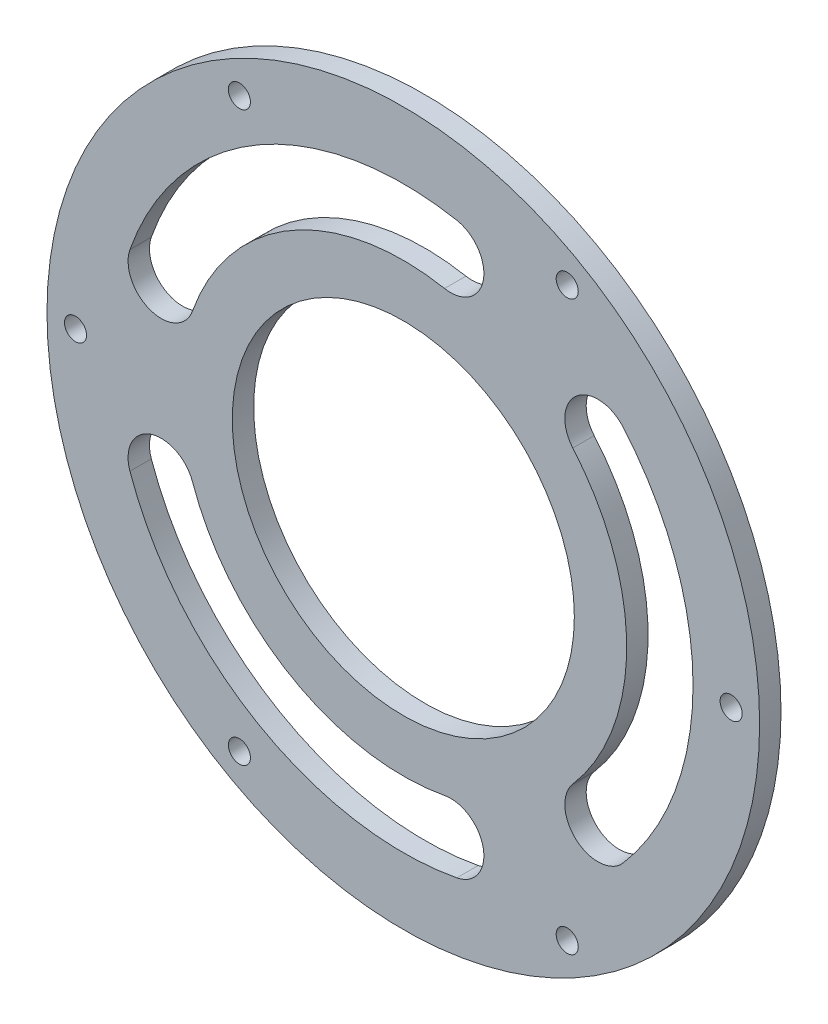
ISO-10303-21;
HEADER;
FILE_DESCRIPTION(('STEP AP214'),'2;1');
FILE_NAME('part.step','',(''),(''),'','','');
FILE_SCHEMA(('AUTOMOTIVE_DESIGN { 1 0 10303 214 1 1 1 1 }'));
ENDSEC;
DATA;
#1=APPLICATION_CONTEXT('core data for automotive mechanical design processes');
#2=APPLICATION_PROTOCOL_DEFINITION('international standard','automotive_design',2000,#1);
#3=PRODUCT_CONTEXT('',#1,'mechanical');
#4=PRODUCT('Part','Part','',(#3));
#5=PRODUCT_RELATED_PRODUCT_CATEGORY('part','',(#4));
#6=PRODUCT_DEFINITION_FORMATION('','',#4);
#7=PRODUCT_DEFINITION_CONTEXT('part definition',#1,'design');
#8=PRODUCT_DEFINITION('design','',#6,#7);
#9=PRODUCT_DEFINITION_SHAPE('','',#8);
#10=(LENGTH_UNIT() NAMED_UNIT(*) SI_UNIT(.MILLI.,.METRE.));
#11=(NAMED_UNIT(*) PLANE_ANGLE_UNIT() SI_UNIT($,.RADIAN.));
#12=(NAMED_UNIT(*) SI_UNIT($,.STERADIAN.) SOLID_ANGLE_UNIT());
#13=UNCERTAINTY_MEASURE_WITH_UNIT(LENGTH_MEASURE(1.E-05),#10,'distance_accuracy_value','');
#14=(GEOMETRIC_REPRESENTATION_CONTEXT(3) GLOBAL_UNCERTAINTY_ASSIGNED_CONTEXT((#13)) GLOBAL_UNIT_ASSIGNED_CONTEXT((#10,
#11,#12)) REPRESENTATION_CONTEXT('',''));
#15=CARTESIAN_POINT('',(0.,0.,0.));
#16=DIRECTION('',(0.,0.,1.));
#17=DIRECTION('',(1.,0.,0.));
#18=AXIS2_PLACEMENT_3D('',#15,#16,#17);
#19=CARTESIAN_POINT('',(0.,0.,3.));
#20=DIRECTION('',(0.,0.,1.));
#21=DIRECTION('',(1.,0.,0.));
#22=AXIS2_PLACEMENT_3D('',#19,#20,#21);
#23=PLANE('',#22);
#24=CARTESIAN_POINT('',(0.,0.,3.));
#25=DIRECTION('',(0.,0.,1.));
#26=DIRECTION('',(1.,0.,0.));
#27=AXIS2_PLACEMENT_3D('',#24,#25,#26);
#28=CIRCLE('',#27,24.);
#29=CARTESIAN_POINT('',(24.,0.,3.));
#30=VERTEX_POINT('',#29);
#31=EDGE_CURVE('E223',#30,#30,#28,.T.);
#32=ORIENTED_EDGE('',*,*,#31,.F.);
#33=EDGE_LOOP('',(#32));
#34=FACE_BOUND('',#33,.T.);
#35=CARTESIAN_POINT('',(-23.,39.8371685740842,3.));
#36=DIRECTION('',(0.,0.,1.));
#37=DIRECTION('',(1.,0.,0.));
#38=AXIS2_PLACEMENT_3D('',#35,#36,#37);
#39=CIRCLE('',#38,1.55);
#40=CARTESIAN_POINT('',(-21.45,39.8371685740842,3.));
#41=VERTEX_POINT('',#40);
#42=EDGE_CURVE('E240',#41,#41,#39,.T.);
#43=ORIENTED_EDGE('',*,*,#42,.F.);
#44=EDGE_LOOP('',(#43));
#45=FACE_BOUND('',#44,.T.);
#46=CARTESIAN_POINT('',(-23.,-39.8371685740842,3.));
#47=DIRECTION('',(0.,0.,1.));
#48=DIRECTION('',(1.,0.,0.));
#49=AXIS2_PLACEMENT_3D('',#46,#47,#48);
#50=CIRCLE('',#49,1.55);
#51=CARTESIAN_POINT('',(-21.45,-39.8371685740842,3.));
#52=VERTEX_POINT('',#51);
#53=EDGE_CURVE('E248',#52,#52,#50,.T.);
#54=ORIENTED_EDGE('',*,*,#53,.F.);
#55=EDGE_LOOP('',(#54));
#56=FACE_BOUND('',#55,.T.);
#57=CARTESIAN_POINT('',(46.,0.,3.));
#58=DIRECTION('',(0.,0.,1.));
#59=DIRECTION('',(1.,0.,0.));
#60=AXIS2_PLACEMENT_3D('',#57,#58,#59);
#61=CIRCLE('',#60,1.55);
#62=CARTESIAN_POINT('',(47.55,0.,3.));
#63=VERTEX_POINT('',#62);
#64=EDGE_CURVE('E11',#63,#63,#61,.T.);
#65=ORIENTED_EDGE('',*,*,#64,.F.);
#66=EDGE_LOOP('',(#65));
#67=FACE_BOUND('',#66,.T.);
#68=CARTESIAN_POINT('',(23.,-39.8371685740842,3.));
#69=DIRECTION('',(0.,0.,1.));
#70=DIRECTION('',(1.,0.,0.));
#71=AXIS2_PLACEMENT_3D('',#68,#69,#70);
#72=CIRCLE('',#71,1.55);
#73=CARTESIAN_POINT('',(24.55,-39.8371685740842,3.));
#74=VERTEX_POINT('',#73);
#75=EDGE_CURVE('E253',#74,#74,#72,.T.);
#76=ORIENTED_EDGE('',*,*,#75,.F.);
#77=EDGE_LOOP('',(#76));
#78=FACE_BOUND('',#77,.T.);
#79=CARTESIAN_POINT('',(-46.,0.,3.));
#80=DIRECTION('',(0.,0.,1.));
#81=DIRECTION('',(1.,0.,0.));
#82=AXIS2_PLACEMENT_3D('',#79,#80,#81);
#83=CIRCLE('',#82,1.54999999999999);
#84=CARTESIAN_POINT('',(-44.45,0.,3.));
#85=VERTEX_POINT('',#84);
#86=EDGE_CURVE('E243',#85,#85,#83,.T.);
#87=ORIENTED_EDGE('',*,*,#86,.F.);
#88=EDGE_LOOP('',(#87));
#89=FACE_BOUND('',#88,.T.);
#90=CARTESIAN_POINT('',(23.,39.8371685740842,3.));
#91=DIRECTION('',(0.,0.,1.));
#92=DIRECTION('',(1.,0.,0.));
#93=AXIS2_PLACEMENT_3D('',#90,#91,#92);
#94=CIRCLE('',#93,1.55);
#95=CARTESIAN_POINT('',(24.55,39.8371685740842,3.));
#96=VERTEX_POINT('',#95);
#97=EDGE_CURVE('E233',#96,#96,#94,.T.);
#98=ORIENTED_EDGE('',*,*,#97,.F.);
#99=EDGE_LOOP('',(#98));
#100=FACE_BOUND('',#99,.T.);
#101=CARTESIAN_POINT('',(-33.9657537869317,11.9301118890619,3.));
#102=DIRECTION('',(0.,0.,1.));
#103=DIRECTION('',(1.,0.,0.));
#104=AXIS2_PLACEMENT_3D('',#101,#102,#103);
#105=CIRCLE('',#104,4.65338187626967);
#106=CARTESIAN_POINT('',(-38.3561877615413,13.4722054014627,3.));
#107=VERTEX_POINT('',#106);
#108=CARTESIAN_POINT('',(-29.5753198123221,10.3880183766611,3.));
#109=VERTEX_POINT('',#108);
#110=EDGE_CURVE('E210',#107,#109,#105,.T.);
#111=ORIENTED_EDGE('',*,*,#110,.F.);
#112=CARTESIAN_POINT('',(0.,0.,3.));
#113=DIRECTION('',(0.,0.,1.));
#114=DIRECTION('',(1.,0.,0.));
#115=AXIS2_PLACEMENT_3D('',#112,#113,#114);
#116=CIRCLE('',#115,40.6533818762697);
#117=CARTESIAN_POINT('',(7.51082175810194,39.9535356945519,3.));
#118=VERTEX_POINT('',#117);
#119=EDGE_CURVE('E191',#118,#107,#116,.T.);
#120=ORIENTED_EDGE('',*,*,#119,.F.);
#121=CARTESIAN_POINT('',(6.65109692754743,35.3802615827013,3.));
#122=DIRECTION('',(0.,0.,1.));
#123=DIRECTION('',(1.,0.,0.));
#124=AXIS2_PLACEMENT_3D('',#121,#122,#123);
#125=CIRCLE('',#124,4.65338187626966);
#126=CARTESIAN_POINT('',(5.79137209699293,30.8069874708507,3.));
#127=VERTEX_POINT('',#126);
#128=EDGE_CURVE('E205',#127,#118,#125,.T.);
#129=ORIENTED_EDGE('',*,*,#128,.F.);
#130=CARTESIAN_POINT('',(0.,0.,3.));
#131=DIRECTION('',(0.,0.,1.));
#132=DIRECTION('',(1.,0.,0.));
#133=AXIS2_PLACEMENT_3D('',#130,#131,#132);
#134=CIRCLE('',#133,31.3466181237303);
#135=EDGE_CURVE('E204',#109,#127,#134,.F.);
#136=ORIENTED_EDGE('',*,*,#135,.F.);
#137=EDGE_LOOP('',(#111,#120,#129,#136));
#138=FACE_BOUND('',#137,.T.);
#139=CARTESIAN_POINT('',(0.,0.,3.));
#140=DIRECTION('',(0.,0.,1.));
#141=DIRECTION('',(1.,0.,0.));
#142=AXIS2_PLACEMENT_3D('',#139,#140,#141);
#143=CIRCLE('',#142,40.6533818762697);
#144=CARTESIAN_POINT('',(-38.3561877615413,-13.4722054014628,3.));
#145=VERTEX_POINT('',#144);
#146=CARTESIAN_POINT('',(7.51082175810197,-39.9535356945519,3.));
#147=VERTEX_POINT('',#146);
#148=EDGE_CURVE('E138',#145,#147,#143,.T.);
#149=ORIENTED_EDGE('',*,*,#148,.F.);
#150=CARTESIAN_POINT('',(-33.9657537869317,-11.9301118890619,3.));
#151=DIRECTION('',(0.,0.,1.));
#152=DIRECTION('',(1.,0.,0.));
#153=AXIS2_PLACEMENT_3D('',#150,#151,#152);
#154=CIRCLE('',#153,4.65338187626966);
#155=CARTESIAN_POINT('',(-29.5753198123221,-10.3880183766611,3.));
#156=VERTEX_POINT('',#155);
#157=EDGE_CURVE('E209',#156,#145,#154,.T.);
#158=ORIENTED_EDGE('',*,*,#157,.F.);
#159=CARTESIAN_POINT('',(0.,0.,3.));
#160=DIRECTION('',(0.,0.,1.));
#161=DIRECTION('',(1.,0.,0.));
#162=AXIS2_PLACEMENT_3D('',#159,#160,#161);
#163=CIRCLE('',#162,31.3466181237303);
#164=CARTESIAN_POINT('',(5.79137209699295,-30.8069874708507,3.));
#165=VERTEX_POINT('',#164);
#166=EDGE_CURVE('E212',#165,#156,#163,.F.);
#167=ORIENTED_EDGE('',*,*,#166,.F.);
#168=CARTESIAN_POINT('',(6.65109692754744,-35.3802615827013,3.));
#169=DIRECTION('',(0.,0.,1.));
#170=DIRECTION('',(1.,0.,0.));
#171=AXIS2_PLACEMENT_3D('',#168,#169,#170);
#172=CIRCLE('',#171,4.65338187626966);
#173=EDGE_CURVE('E214',#147,#165,#172,.T.);
#174=ORIENTED_EDGE('',*,*,#173,.F.);
#175=EDGE_LOOP('',(#149,#158,#167,#174));
#176=FACE_BOUND('',#175,.T.);
#177=CARTESIAN_POINT('',(0.,0.,3.));
#178=DIRECTION('',(0.,0.,1.));
#179=DIRECTION('',(1.,0.,0.));
#180=AXIS2_PLACEMENT_3D('',#177,#178,#179);
#181=CIRCLE('',#180,40.6533818762697);
#182=CARTESIAN_POINT('',(30.8453660034393,-26.4813302930891,3.));
#183=VERTEX_POINT('',#182);
#184=CARTESIAN_POINT('',(30.8453660034393,26.4813302930891,3.));
#185=VERTEX_POINT('',#184);
#186=EDGE_CURVE('E225',#183,#185,#181,.T.);
#187=ORIENTED_EDGE('',*,*,#186,.F.);
#188=CARTESIAN_POINT('',(27.3146568593842,-23.4501496936394,3.));
#189=DIRECTION('',(0.,0.,1.));
#190=DIRECTION('',(1.,0.,0.));
#191=AXIS2_PLACEMENT_3D('',#188,#189,#190);
#192=CIRCLE('',#191,4.65338187626967);
#193=CARTESIAN_POINT('',(23.7839477153291,-20.4189690941896,3.));
#194=VERTEX_POINT('',#193);
#195=EDGE_CURVE('E216',#194,#183,#192,.T.);
#196=ORIENTED_EDGE('',*,*,#195,.F.);
#197=CARTESIAN_POINT('',(0.,0.,3.));
#198=DIRECTION('',(0.,0.,1.));
#199=DIRECTION('',(1.,0.,0.));
#200=AXIS2_PLACEMENT_3D('',#197,#198,#199);
#201=CIRCLE('',#200,31.3466181237303);
#202=CARTESIAN_POINT('',(23.7839477153291,20.4189690941896,3.));
#203=VERTEX_POINT('',#202);
#204=EDGE_CURVE('E219',#203,#194,#201,.F.);
#205=ORIENTED_EDGE('',*,*,#204,.F.);
#206=CARTESIAN_POINT('',(27.3146568593842,23.4501496936394,3.));
#207=DIRECTION('',(0.,0.,1.));
#208=DIRECTION('',(1.,0.,0.));
#209=AXIS2_PLACEMENT_3D('',#206,#207,#208);
#210=CIRCLE('',#209,4.65338187626967);
#211=EDGE_CURVE('E220',#185,#203,#210,.T.);
#212=ORIENTED_EDGE('',*,*,#211,.F.);
#213=EDGE_LOOP('',(#187,#196,#205,#212));
#214=FACE_BOUND('',#213,.T.);
#215=CARTESIAN_POINT('',(0.,0.,3.));
#216=DIRECTION('',(0.,0.,1.));
#217=DIRECTION('',(1.,0.,0.));
#218=AXIS2_PLACEMENT_3D('',#215,#216,#217);
#219=CIRCLE('',#218,50.);
#220=CARTESIAN_POINT('',(50.,0.,3.));
#221=VERTEX_POINT('',#220);
#222=EDGE_CURVE('E172',#221,#221,#219,.T.);
#223=ORIENTED_EDGE('',*,*,#222,.T.);
#224=EDGE_LOOP('',(#223));
#225=FACE_BOUND('',#224,.T.);
#226=ADVANCED_FACE('F43',(#34,#45,#56,#67,#78,#89,#100,#138,#176,#214,#225),#23,.T.);
#227=CARTESIAN_POINT('',(0.,0.,0.));
#228=DIRECTION('',(0.,0.,1.));
#229=DIRECTION('',(1.,0.,0.));
#230=AXIS2_PLACEMENT_3D('',#227,#228,#229);
#231=PLANE('',#230);
#232=CARTESIAN_POINT('',(0.,0.,0.));
#233=DIRECTION('',(0.,0.,1.));
#234=DIRECTION('',(1.,0.,0.));
#235=AXIS2_PLACEMENT_3D('',#232,#233,#234);
#236=CIRCLE('',#235,24.);
#237=CARTESIAN_POINT('',(24.,0.,0.));
#238=VERTEX_POINT('',#237);
#239=EDGE_CURVE('E224',#238,#238,#236,.T.);
#240=ORIENTED_EDGE('',*,*,#239,.T.);
#241=EDGE_LOOP('',(#240));
#242=FACE_BOUND('',#241,.T.);
#243=CARTESIAN_POINT('',(23.,39.8371685740842,0.));
#244=DIRECTION('',(0.,0.,1.));
#245=DIRECTION('',(1.,0.,0.));
#246=AXIS2_PLACEMENT_3D('',#243,#244,#245);
#247=CIRCLE('',#246,1.55);
#248=CARTESIAN_POINT('',(24.55,39.8371685740842,0.));
#249=VERTEX_POINT('',#248);
#250=EDGE_CURVE('E226',#249,#249,#247,.T.);
#251=ORIENTED_EDGE('',*,*,#250,.T.);
#252=EDGE_LOOP('',(#251));
#253=FACE_BOUND('',#252,.T.);
#254=CARTESIAN_POINT('',(-23.,39.8371685740842,0.));
#255=DIRECTION('',(0.,0.,1.));
#256=DIRECTION('',(1.,0.,0.));
#257=AXIS2_PLACEMENT_3D('',#254,#255,#256);
#258=CIRCLE('',#257,1.55);
#259=CARTESIAN_POINT('',(-21.45,39.8371685740842,0.));
#260=VERTEX_POINT('',#259);
#261=EDGE_CURVE('E234',#260,#260,#258,.T.);
#262=ORIENTED_EDGE('',*,*,#261,.T.);
#263=EDGE_LOOP('',(#262));
#264=FACE_BOUND('',#263,.T.);
#265=CARTESIAN_POINT('',(-46.,0.,0.));
#266=DIRECTION('',(0.,0.,1.));
#267=DIRECTION('',(1.,0.,0.));
#268=AXIS2_PLACEMENT_3D('',#265,#266,#267);
#269=CIRCLE('',#268,1.54999999999999);
#270=CARTESIAN_POINT('',(-44.45,0.,0.));
#271=VERTEX_POINT('',#270);
#272=EDGE_CURVE('E239',#271,#271,#269,.T.);
#273=ORIENTED_EDGE('',*,*,#272,.T.);
#274=EDGE_LOOP('',(#273));
#275=FACE_BOUND('',#274,.T.);
#276=CARTESIAN_POINT('',(-23.,-39.8371685740842,0.));
#277=DIRECTION('',(0.,0.,1.));
#278=DIRECTION('',(1.,0.,0.));
#279=AXIS2_PLACEMENT_3D('',#276,#277,#278);
#280=CIRCLE('',#279,1.55);
#281=CARTESIAN_POINT('',(-21.45,-39.8371685740842,0.));
#282=VERTEX_POINT('',#281);
#283=EDGE_CURVE('E246',#282,#282,#280,.T.);
#284=ORIENTED_EDGE('',*,*,#283,.T.);
#285=EDGE_LOOP('',(#284));
#286=FACE_BOUND('',#285,.T.);
#287=CARTESIAN_POINT('',(23.,-39.8371685740842,0.));
#288=DIRECTION('',(0.,0.,1.));
#289=DIRECTION('',(1.,0.,0.));
#290=AXIS2_PLACEMENT_3D('',#287,#288,#289);
#291=CIRCLE('',#290,1.55);
#292=CARTESIAN_POINT('',(24.55,-39.8371685740842,0.));
#293=VERTEX_POINT('',#292);
#294=EDGE_CURVE('E255',#293,#293,#291,.T.);
#295=ORIENTED_EDGE('',*,*,#294,.T.);
#296=EDGE_LOOP('',(#295));
#297=FACE_BOUND('',#296,.T.);
#298=CARTESIAN_POINT('',(46.,0.,0.));
#299=DIRECTION('',(0.,0.,1.));
#300=DIRECTION('',(1.,0.,0.));
#301=AXIS2_PLACEMENT_3D('',#298,#299,#300);
#302=CIRCLE('',#301,1.55);
#303=CARTESIAN_POINT('',(47.55,0.,0.));
#304=VERTEX_POINT('',#303);
#305=EDGE_CURVE('E50',#304,#304,#302,.T.);
#306=ORIENTED_EDGE('',*,*,#305,.T.);
#307=EDGE_LOOP('',(#306));
#308=FACE_BOUND('',#307,.T.);
#309=CARTESIAN_POINT('',(0.,0.,0.));
#310=DIRECTION('',(0.,0.,-1.));
#311=DIRECTION('',(-1.,0.,0.));
#312=AXIS2_PLACEMENT_3D('',#309,#310,#311);
#313=CIRCLE('',#312,40.6533818762697);
#314=CARTESIAN_POINT('',(-38.3561877615413,13.4722054014627,0.));
#315=VERTEX_POINT('',#314);
#316=CARTESIAN_POINT('',(7.51082175810194,39.9535356945519,0.));
#317=VERTEX_POINT('',#316);
#318=EDGE_CURVE('E159',#315,#317,#313,.T.);
#319=ORIENTED_EDGE('',*,*,#318,.F.);
#320=CARTESIAN_POINT('',(-33.9657537869317,11.9301118890619,0.));
#321=DIRECTION('',(0.,0.,-1.));
#322=DIRECTION('',(-1.,0.,0.));
#323=AXIS2_PLACEMENT_3D('',#320,#321,#322);
#324=CIRCLE('',#323,4.65338187626967);
#325=CARTESIAN_POINT('',(-29.5753198123221,10.3880183766611,0.));
#326=VERTEX_POINT('',#325);
#327=EDGE_CURVE('E157',#326,#315,#324,.T.);
#328=ORIENTED_EDGE('',*,*,#327,.F.);
#329=CARTESIAN_POINT('',(0.,0.,0.));
#330=DIRECTION('',(0.,0.,1.));
#331=DIRECTION('',(-1.,0.,0.));
#332=AXIS2_PLACEMENT_3D('',#329,#330,#331);
#333=CIRCLE('',#332,31.3466181237303);
#334=CARTESIAN_POINT('',(5.79137209699293,30.8069874708507,0.));
#335=VERTEX_POINT('',#334);
#336=EDGE_CURVE('E189',#335,#326,#333,.T.);
#337=ORIENTED_EDGE('',*,*,#336,.F.);
#338=CARTESIAN_POINT('',(6.65109692754743,35.3802615827013,0.));
#339=DIRECTION('',(0.,0.,-1.));
#340=DIRECTION('',(-1.,0.,0.));
#341=AXIS2_PLACEMENT_3D('',#338,#339,#340);
#342=CIRCLE('',#341,4.65338187626966);
#343=EDGE_CURVE('E184',#317,#335,#342,.T.);
#344=ORIENTED_EDGE('',*,*,#343,.F.);
#345=EDGE_LOOP('',(#319,#328,#337,#344));
#346=FACE_BOUND('',#345,.T.);
#347=CARTESIAN_POINT('',(-33.9657537869317,-11.9301118890619,0.));
#348=DIRECTION('',(0.,0.,-1.));
#349=DIRECTION('',(-1.,0.,0.));
#350=AXIS2_PLACEMENT_3D('',#347,#348,#349);
#351=CIRCLE('',#350,4.65338187626966);
#352=CARTESIAN_POINT('',(-38.3561877615413,-13.4722054014628,0.));
#353=VERTEX_POINT('',#352);
#354=CARTESIAN_POINT('',(-29.5753198123221,-10.3880183766611,0.));
#355=VERTEX_POINT('',#354);
#356=EDGE_CURVE('E160',#353,#355,#351,.T.);
#357=ORIENTED_EDGE('',*,*,#356,.F.);
#358=CARTESIAN_POINT('',(0.,0.,0.));
#359=DIRECTION('',(0.,0.,-1.));
#360=DIRECTION('',(-1.,0.,0.));
#361=AXIS2_PLACEMENT_3D('',#358,#359,#360);
#362=CIRCLE('',#361,40.6533818762697);
#363=CARTESIAN_POINT('',(7.51082175810197,-39.9535356945519,0.));
#364=VERTEX_POINT('',#363);
#365=EDGE_CURVE('E136',#364,#353,#362,.T.);
#366=ORIENTED_EDGE('',*,*,#365,.F.);
#367=CARTESIAN_POINT('',(6.65109692754744,-35.3802615827013,0.));
#368=DIRECTION('',(0.,0.,-1.));
#369=DIRECTION('',(-1.,0.,0.));
#370=AXIS2_PLACEMENT_3D('',#367,#368,#369);
#371=CIRCLE('',#370,4.65338187626966);
#372=CARTESIAN_POINT('',(5.79137209699295,-30.8069874708507,0.));
#373=VERTEX_POINT('',#372);
#374=EDGE_CURVE('E147',#373,#364,#371,.T.);
#375=ORIENTED_EDGE('',*,*,#374,.F.);
#376=CARTESIAN_POINT('',(0.,0.,0.));
#377=DIRECTION('',(0.,0.,1.));
#378=DIRECTION('',(-1.,0.,0.));
#379=AXIS2_PLACEMENT_3D('',#376,#377,#378);
#380=CIRCLE('',#379,31.3466181237303);
#381=EDGE_CURVE('E152',#355,#373,#380,.T.);
#382=ORIENTED_EDGE('',*,*,#381,.F.);
#383=EDGE_LOOP('',(#357,#366,#375,#382));
#384=FACE_BOUND('',#383,.T.);
#385=CARTESIAN_POINT('',(27.3146568593842,-23.4501496936394,0.));
#386=DIRECTION('',(0.,0.,-1.));
#387=DIRECTION('',(-1.,0.,0.));
#388=AXIS2_PLACEMENT_3D('',#385,#386,#387);
#389=CIRCLE('',#388,4.65338187626967);
#390=CARTESIAN_POINT('',(30.8453660034393,-26.4813302930891,0.));
#391=VERTEX_POINT('',#390);
#392=CARTESIAN_POINT('',(23.7839477153291,-20.4189690941896,0.));
#393=VERTEX_POINT('',#392);
#394=EDGE_CURVE('E179',#391,#393,#389,.T.);
#395=ORIENTED_EDGE('',*,*,#394,.F.);
#396=CARTESIAN_POINT('',(0.,0.,0.));
#397=DIRECTION('',(0.,0.,-1.));
#398=DIRECTION('',(-1.,0.,0.));
#399=AXIS2_PLACEMENT_3D('',#396,#397,#398);
#400=CIRCLE('',#399,40.6533818762697);
#401=CARTESIAN_POINT('',(30.8453660034393,26.4813302930891,0.));
#402=VERTEX_POINT('',#401);
#403=EDGE_CURVE('E141',#402,#391,#400,.T.);
#404=ORIENTED_EDGE('',*,*,#403,.F.);
#405=CARTESIAN_POINT('',(27.3146568593842,23.4501496936394,0.));
#406=DIRECTION('',(0.,0.,-1.));
#407=DIRECTION('',(-1.,0.,0.));
#408=AXIS2_PLACEMENT_3D('',#405,#406,#407);
#409=CIRCLE('',#408,4.65338187626967);
#410=CARTESIAN_POINT('',(23.7839477153291,20.4189690941896,0.));
#411=VERTEX_POINT('',#410);
#412=EDGE_CURVE('E166',#411,#402,#409,.T.);
#413=ORIENTED_EDGE('',*,*,#412,.F.);
#414=CARTESIAN_POINT('',(0.,0.,0.));
#415=DIRECTION('',(0.,0.,1.));
#416=DIRECTION('',(-1.,0.,0.));
#417=AXIS2_PLACEMENT_3D('',#414,#415,#416);
#418=CIRCLE('',#417,31.3466181237303);
#419=EDGE_CURVE('E180',#393,#411,#418,.T.);
#420=ORIENTED_EDGE('',*,*,#419,.F.);
#421=EDGE_LOOP('',(#395,#404,#413,#420));
#422=FACE_BOUND('',#421,.T.);
#423=CARTESIAN_POINT('',(0.,0.,0.));
#424=DIRECTION('',(0.,0.,-1.));
#425=DIRECTION('',(-1.,0.,0.));
#426=AXIS2_PLACEMENT_3D('',#423,#424,#425);
#427=CIRCLE('',#426,50.);
#428=CARTESIAN_POINT('',(-50.,0.,0.));
#429=VERTEX_POINT('',#428);
#430=EDGE_CURVE('E315',#429,#429,#427,.T.);
#431=ORIENTED_EDGE('',*,*,#430,.T.);
#432=EDGE_LOOP('',(#431));
#433=FACE_BOUND('',#432,.T.);
#434=ADVANCED_FACE('F44',(#242,#253,#264,#275,#286,#297,#308,#346,#384,#422,#433),#231,.F.);
#435=CARTESIAN_POINT('',(46.,0.,3.));
#436=DIRECTION('',(0.,0.,-1.));
#437=DIRECTION('',(-1.,0.,0.));
#438=AXIS2_PLACEMENT_3D('',#435,#436,#437);
#439=CYLINDRICAL_SURFACE('',#438,1.55);
#440=ORIENTED_EDGE('',*,*,#64,.T.);
#441=EDGE_LOOP('',(#440));
#442=FACE_BOUND('',#441,.T.);
#443=ORIENTED_EDGE('',*,*,#305,.F.);
#444=EDGE_LOOP('',(#443));
#445=FACE_BOUND('',#444,.T.);
#446=ADVANCED_FACE('F266',(#442,#445),#439,.F.);
#447=CARTESIAN_POINT('',(23.,-39.8371685740842,3.));
#448=DIRECTION('',(0.,0.,-1.));
#449=DIRECTION('',(-1.,0.,0.));
#450=AXIS2_PLACEMENT_3D('',#447,#448,#449);
#451=CYLINDRICAL_SURFACE('',#450,1.55);
#452=ORIENTED_EDGE('',*,*,#75,.T.);
#453=EDGE_LOOP('',(#452));
#454=FACE_BOUND('',#453,.T.);
#455=ORIENTED_EDGE('',*,*,#294,.F.);
#456=EDGE_LOOP('',(#455));
#457=FACE_BOUND('',#456,.T.);
#458=ADVANCED_FACE('F264',(#454,#457),#451,.F.);
#459=CARTESIAN_POINT('',(-23.,-39.8371685740842,3.));
#460=DIRECTION('',(0.,0.,-1.));
#461=DIRECTION('',(-1.,0.,0.));
#462=AXIS2_PLACEMENT_3D('',#459,#460,#461);
#463=CYLINDRICAL_SURFACE('',#462,1.55);
#464=ORIENTED_EDGE('',*,*,#53,.T.);
#465=EDGE_LOOP('',(#464));
#466=FACE_BOUND('',#465,.T.);
#467=ORIENTED_EDGE('',*,*,#283,.F.);
#468=EDGE_LOOP('',(#467));
#469=FACE_BOUND('',#468,.T.);
#470=ADVANCED_FACE('F265',(#466,#469),#463,.F.);
#471=CARTESIAN_POINT('',(-46.,0.,3.));
#472=DIRECTION('',(0.,0.,-1.));
#473=DIRECTION('',(-1.,0.,0.));
#474=AXIS2_PLACEMENT_3D('',#471,#472,#473);
#475=CYLINDRICAL_SURFACE('',#474,1.54999999999999);
#476=ORIENTED_EDGE('',*,*,#86,.T.);
#477=EDGE_LOOP('',(#476));
#478=FACE_BOUND('',#477,.T.);
#479=ORIENTED_EDGE('',*,*,#272,.F.);
#480=EDGE_LOOP('',(#479));
#481=FACE_BOUND('',#480,.T.);
#482=ADVANCED_FACE('F271',(#478,#481),#475,.F.);
#483=CARTESIAN_POINT('',(-23.,39.8371685740842,3.));
#484=DIRECTION('',(0.,0.,-1.));
#485=DIRECTION('',(-1.,0.,0.));
#486=AXIS2_PLACEMENT_3D('',#483,#484,#485);
#487=CYLINDRICAL_SURFACE('',#486,1.55);
#488=ORIENTED_EDGE('',*,*,#42,.T.);
#489=EDGE_LOOP('',(#488));
#490=FACE_BOUND('',#489,.T.);
#491=ORIENTED_EDGE('',*,*,#261,.F.);
#492=EDGE_LOOP('',(#491));
#493=FACE_BOUND('',#492,.T.);
#494=ADVANCED_FACE('F375',(#490,#493),#487,.F.);
#495=CARTESIAN_POINT('',(23.,39.8371685740842,3.));
#496=DIRECTION('',(0.,0.,-1.));
#497=DIRECTION('',(-1.,0.,0.));
#498=AXIS2_PLACEMENT_3D('',#495,#496,#497);
#499=CYLINDRICAL_SURFACE('',#498,1.55);
#500=ORIENTED_EDGE('',*,*,#97,.T.);
#501=EDGE_LOOP('',(#500));
#502=FACE_BOUND('',#501,.T.);
#503=ORIENTED_EDGE('',*,*,#250,.F.);
#504=EDGE_LOOP('',(#503));
#505=FACE_BOUND('',#504,.T.);
#506=ADVANCED_FACE('F368',(#502,#505),#499,.F.);
#507=CARTESIAN_POINT('',(0.,0.,0.));
#508=DIRECTION('',(0.,0.,1.));
#509=DIRECTION('',(1.,0.,0.));
#510=AXIS2_PLACEMENT_3D('',#507,#508,#509);
#511=CYLINDRICAL_SURFACE('',#510,24.);
#512=ORIENTED_EDGE('',*,*,#239,.F.);
#513=EDGE_LOOP('',(#512));
#514=FACE_BOUND('',#513,.T.);
#515=ORIENTED_EDGE('',*,*,#31,.T.);
#516=EDGE_LOOP('',(#515));
#517=FACE_BOUND('',#516,.T.);
#518=ADVANCED_FACE('F364',(#514,#517),#511,.F.);
#519=CARTESIAN_POINT('',(-33.9657537869317,11.9301118890619,10.));
#520=DIRECTION('',(0.,0.,-1.));
#521=DIRECTION('',(-1.,0.,0.));
#522=AXIS2_PLACEMENT_3D('',#519,#520,#521);
#523=CYLINDRICAL_SURFACE('',#522,4.65338187626967);
#524=ORIENTED_EDGE('',*,*,#110,.T.);
#525=DIRECTION('',(0.,0.,-1.));
#526=VECTOR('',#525,1.);
#527=CARTESIAN_POINT('',(-29.5753198123221,10.3880183766611,10.));
#528=LINE('',#527,#526);
#529=EDGE_CURVE('E195',#109,#326,#528,.T.);
#530=ORIENTED_EDGE('',*,*,#529,.T.);
#531=ORIENTED_EDGE('',*,*,#327,.T.);
#532=DIRECTION('',(0.,0.,-1.));
#533=VECTOR('',#532,1.);
#534=CARTESIAN_POINT('',(-38.3561877615413,13.4722054014627,10.));
#535=LINE('',#534,#533);
#536=EDGE_CURVE('E192',#107,#315,#535,.T.);
#537=ORIENTED_EDGE('',*,*,#536,.F.);
#538=EDGE_LOOP('',(#524,#530,#531,#537));
#539=FACE_BOUND('',#538,.T.);
#540=ADVANCED_FACE('F352',(#539),#523,.F.);
#541=CARTESIAN_POINT('',(0.,0.,10.));
#542=DIRECTION('',(0.,0.,-1.));
#543=DIRECTION('',(-1.,0.,0.));
#544=AXIS2_PLACEMENT_3D('',#541,#542,#543);
#545=CYLINDRICAL_SURFACE('',#544,31.3466181237303);
#546=ORIENTED_EDGE('',*,*,#135,.T.);
#547=DIRECTION('',(0.,0.,-1.));
#548=VECTOR('',#547,1.);
#549=CARTESIAN_POINT('',(5.79137209699293,30.8069874708507,10.));
#550=LINE('',#549,#548);
#551=EDGE_CURVE('E193',#127,#335,#550,.T.);
#552=ORIENTED_EDGE('',*,*,#551,.T.);
#553=ORIENTED_EDGE('',*,*,#336,.T.);
#554=ORIENTED_EDGE('',*,*,#529,.F.);
#555=EDGE_LOOP('',(#546,#552,#553,#554));
#556=FACE_BOUND('',#555,.T.);
#557=ADVANCED_FACE('F348',(#556),#545,.T.);
#558=CARTESIAN_POINT('',(6.65109692754743,35.3802615827013,10.));
#559=DIRECTION('',(0.,0.,-1.));
#560=DIRECTION('',(-1.,0.,0.));
#561=AXIS2_PLACEMENT_3D('',#558,#559,#560);
#562=CYLINDRICAL_SURFACE('',#561,4.65338187626966);
#563=ORIENTED_EDGE('',*,*,#128,.T.);
#564=DIRECTION('',(0.,0.,-1.));
#565=VECTOR('',#564,1.);
#566=CARTESIAN_POINT('',(7.51082175810194,39.9535356945519,10.));
#567=LINE('',#566,#565);
#568=EDGE_CURVE('E197',#118,#317,#567,.T.);
#569=ORIENTED_EDGE('',*,*,#568,.T.);
#570=ORIENTED_EDGE('',*,*,#343,.T.);
#571=ORIENTED_EDGE('',*,*,#551,.F.);
#572=EDGE_LOOP('',(#563,#569,#570,#571));
#573=FACE_BOUND('',#572,.T.);
#574=ADVANCED_FACE('F355',(#573),#562,.F.);
#575=CARTESIAN_POINT('',(0.,0.,10.));
#576=DIRECTION('',(0.,0.,-1.));
#577=DIRECTION('',(-1.,0.,0.));
#578=AXIS2_PLACEMENT_3D('',#575,#576,#577);
#579=CYLINDRICAL_SURFACE('',#578,40.6533818762697);
#580=ORIENTED_EDGE('',*,*,#119,.T.);
#581=ORIENTED_EDGE('',*,*,#536,.T.);
#582=ORIENTED_EDGE('',*,*,#318,.T.);
#583=ORIENTED_EDGE('',*,*,#568,.F.);
#584=EDGE_LOOP('',(#580,#581,#582,#583));
#585=FACE_BOUND('',#584,.T.);
#586=ADVANCED_FACE('F357',(#585),#579,.F.);
#587=CARTESIAN_POINT('',(0.,0.,10.));
#588=DIRECTION('',(0.,0.,-1.));
#589=DIRECTION('',(-1.,0.,0.));
#590=AXIS2_PLACEMENT_3D('',#587,#588,#589);
#591=CYLINDRICAL_SURFACE('',#590,40.6533818762697);
#592=ORIENTED_EDGE('',*,*,#148,.T.);
#593=DIRECTION('',(0.,0.,-1.));
#594=VECTOR('',#593,1.);
#595=CARTESIAN_POINT('',(7.51082175810197,-39.9535356945519,10.));
#596=LINE('',#595,#594);
#597=EDGE_CURVE('E131',#147,#364,#596,.T.);
#598=ORIENTED_EDGE('',*,*,#597,.T.);
#599=ORIENTED_EDGE('',*,*,#365,.T.);
#600=DIRECTION('',(0.,0.,-1.));
#601=VECTOR('',#600,1.);
#602=CARTESIAN_POINT('',(-38.3561877615413,-13.4722054014628,10.));
#603=LINE('',#602,#601);
#604=EDGE_CURVE('E154',#145,#353,#603,.T.);
#605=ORIENTED_EDGE('',*,*,#604,.F.);
#606=EDGE_LOOP('',(#592,#598,#599,#605));
#607=FACE_BOUND('',#606,.T.);
#608=ADVANCED_FACE('F134',(#607),#591,.F.);
#609=CARTESIAN_POINT('',(6.65109692754744,-35.3802615827013,10.));
#610=DIRECTION('',(0.,0.,-1.));
#611=DIRECTION('',(-1.,0.,0.));
#612=AXIS2_PLACEMENT_3D('',#609,#610,#611);
#613=CYLINDRICAL_SURFACE('',#612,4.65338187626966);
#614=ORIENTED_EDGE('',*,*,#173,.T.);
#615=DIRECTION('',(0.,0.,-1.));
#616=VECTOR('',#615,1.);
#617=CARTESIAN_POINT('',(5.79137209699295,-30.8069874708507,10.));
#618=LINE('',#617,#616);
#619=EDGE_CURVE('E145',#165,#373,#618,.T.);
#620=ORIENTED_EDGE('',*,*,#619,.T.);
#621=ORIENTED_EDGE('',*,*,#374,.T.);
#622=ORIENTED_EDGE('',*,*,#597,.F.);
#623=EDGE_LOOP('',(#614,#620,#621,#622));
#624=FACE_BOUND('',#623,.T.);
#625=ADVANCED_FACE('F150',(#624),#613,.F.);
#626=CARTESIAN_POINT('',(0.,0.,10.));
#627=DIRECTION('',(0.,0.,-1.));
#628=DIRECTION('',(-1.,0.,0.));
#629=AXIS2_PLACEMENT_3D('',#626,#627,#628);
#630=CYLINDRICAL_SURFACE('',#629,31.3466181237303);
#631=ORIENTED_EDGE('',*,*,#166,.T.);
#632=DIRECTION('',(0.,0.,-1.));
#633=VECTOR('',#632,1.);
#634=CARTESIAN_POINT('',(-29.5753198123221,-10.3880183766611,10.));
#635=LINE('',#634,#633);
#636=EDGE_CURVE('E66',#156,#355,#635,.T.);
#637=ORIENTED_EDGE('',*,*,#636,.T.);
#638=ORIENTED_EDGE('',*,*,#381,.T.);
#639=ORIENTED_EDGE('',*,*,#619,.F.);
#640=EDGE_LOOP('',(#631,#637,#638,#639));
#641=FACE_BOUND('',#640,.T.);
#642=ADVANCED_FACE('F318',(#641),#630,.T.);
#643=CARTESIAN_POINT('',(-33.9657537869317,-11.9301118890619,10.));
#644=DIRECTION('',(0.,0.,-1.));
#645=DIRECTION('',(-1.,0.,0.));
#646=AXIS2_PLACEMENT_3D('',#643,#644,#645);
#647=CYLINDRICAL_SURFACE('',#646,4.65338187626966);
#648=ORIENTED_EDGE('',*,*,#157,.T.);
#649=ORIENTED_EDGE('',*,*,#604,.T.);
#650=ORIENTED_EDGE('',*,*,#356,.T.);
#651=ORIENTED_EDGE('',*,*,#636,.F.);
#652=EDGE_LOOP('',(#648,#649,#650,#651));
#653=FACE_BOUND('',#652,.T.);
#654=ADVANCED_FACE('F325',(#653),#647,.F.);
#655=CARTESIAN_POINT('',(0.,0.,10.));
#656=DIRECTION('',(0.,0.,-1.));
#657=DIRECTION('',(-1.,0.,0.));
#658=AXIS2_PLACEMENT_3D('',#655,#656,#657);
#659=CYLINDRICAL_SURFACE('',#658,40.6533818762697);
#660=ORIENTED_EDGE('',*,*,#186,.T.);
#661=DIRECTION('',(0.,0.,-1.));
#662=VECTOR('',#661,1.);
#663=CARTESIAN_POINT('',(30.8453660034393,26.4813302930891,10.));
#664=LINE('',#663,#662);
#665=EDGE_CURVE('E175',#185,#402,#664,.T.);
#666=ORIENTED_EDGE('',*,*,#665,.T.);
#667=ORIENTED_EDGE('',*,*,#403,.T.);
#668=DIRECTION('',(0.,0.,-1.));
#669=VECTOR('',#668,1.);
#670=CARTESIAN_POINT('',(30.8453660034393,-26.4813302930891,10.));
#671=LINE('',#670,#669);
#672=EDGE_CURVE('E164',#183,#391,#671,.T.);
#673=ORIENTED_EDGE('',*,*,#672,.F.);
#674=EDGE_LOOP('',(#660,#666,#667,#673));
#675=FACE_BOUND('',#674,.T.);
#676=ADVANCED_FACE('F321',(#675),#659,.F.);
#677=CARTESIAN_POINT('',(27.3146568593842,23.4501496936394,10.));
#678=DIRECTION('',(0.,0.,-1.));
#679=DIRECTION('',(-1.,0.,0.));
#680=AXIS2_PLACEMENT_3D('',#677,#678,#679);
#681=CYLINDRICAL_SURFACE('',#680,4.65338187626967);
#682=ORIENTED_EDGE('',*,*,#211,.T.);
#683=DIRECTION('',(0.,0.,-1.));
#684=VECTOR('',#683,1.);
#685=CARTESIAN_POINT('',(23.7839477153291,20.4189690941896,10.));
#686=LINE('',#685,#684);
#687=EDGE_CURVE('E167',#203,#411,#686,.T.);
#688=ORIENTED_EDGE('',*,*,#687,.T.);
#689=ORIENTED_EDGE('',*,*,#412,.T.);
#690=ORIENTED_EDGE('',*,*,#665,.F.);
#691=EDGE_LOOP('',(#682,#688,#689,#690));
#692=FACE_BOUND('',#691,.T.);
#693=ADVANCED_FACE('F330',(#692),#681,.F.);
#694=CARTESIAN_POINT('',(0.,0.,10.));
#695=DIRECTION('',(0.,0.,-1.));
#696=DIRECTION('',(-1.,0.,0.));
#697=AXIS2_PLACEMENT_3D('',#694,#695,#696);
#698=CYLINDRICAL_SURFACE('',#697,31.3466181237303);
#699=ORIENTED_EDGE('',*,*,#204,.T.);
#700=DIRECTION('',(0.,0.,-1.));
#701=VECTOR('',#700,1.);
#702=CARTESIAN_POINT('',(23.7839477153291,-20.4189690941896,10.));
#703=LINE('',#702,#701);
#704=EDGE_CURVE('E59',#194,#393,#703,.T.);
#705=ORIENTED_EDGE('',*,*,#704,.T.);
#706=ORIENTED_EDGE('',*,*,#419,.T.);
#707=ORIENTED_EDGE('',*,*,#687,.F.);
#708=EDGE_LOOP('',(#699,#705,#706,#707));
#709=FACE_BOUND('',#708,.T.);
#710=ADVANCED_FACE('F345',(#709),#698,.T.);
#711=CARTESIAN_POINT('',(27.3146568593842,-23.4501496936394,10.));
#712=DIRECTION('',(0.,0.,-1.));
#713=DIRECTION('',(-1.,0.,0.));
#714=AXIS2_PLACEMENT_3D('',#711,#712,#713);
#715=CYLINDRICAL_SURFACE('',#714,4.65338187626967);
#716=ORIENTED_EDGE('',*,*,#195,.T.);
#717=ORIENTED_EDGE('',*,*,#672,.T.);
#718=ORIENTED_EDGE('',*,*,#394,.T.);
#719=ORIENTED_EDGE('',*,*,#704,.F.);
#720=EDGE_LOOP('',(#716,#717,#718,#719));
#721=FACE_BOUND('',#720,.T.);
#722=ADVANCED_FACE('F339',(#721),#715,.F.);
#723=CARTESIAN_POINT('',(0.,0.,10.));
#724=DIRECTION('',(0.,0.,-1.));
#725=DIRECTION('',(-1.,0.,0.));
#726=AXIS2_PLACEMENT_3D('',#723,#724,#725);
#727=CYLINDRICAL_SURFACE('',#726,50.);
#728=ORIENTED_EDGE('',*,*,#222,.F.);
#729=EDGE_LOOP('',(#728));
#730=FACE_BOUND('',#729,.T.);
#731=ORIENTED_EDGE('',*,*,#430,.F.);
#732=EDGE_LOOP('',(#731));
#733=FACE_BOUND('',#732,.T.);
#734=ADVANCED_FACE('F342',(#730,#733),#727,.T.);
#735=CLOSED_SHELL('',(#226,#434,#446,#458,#470,#482,#494,#506,#518,#540,#557,#574,#586,#608,
#625,#642,#654,#676,#693,#710,#722,#734));
#736=MANIFOLD_SOLID_BREP('B2',#735);
#737=ADVANCED_BREP_SHAPE_REPRESENTATION('',(#18,#736),#14);
#738=SHAPE_DEFINITION_REPRESENTATION(#9,#737);
ENDSEC;
END-ISO-10303-21;
